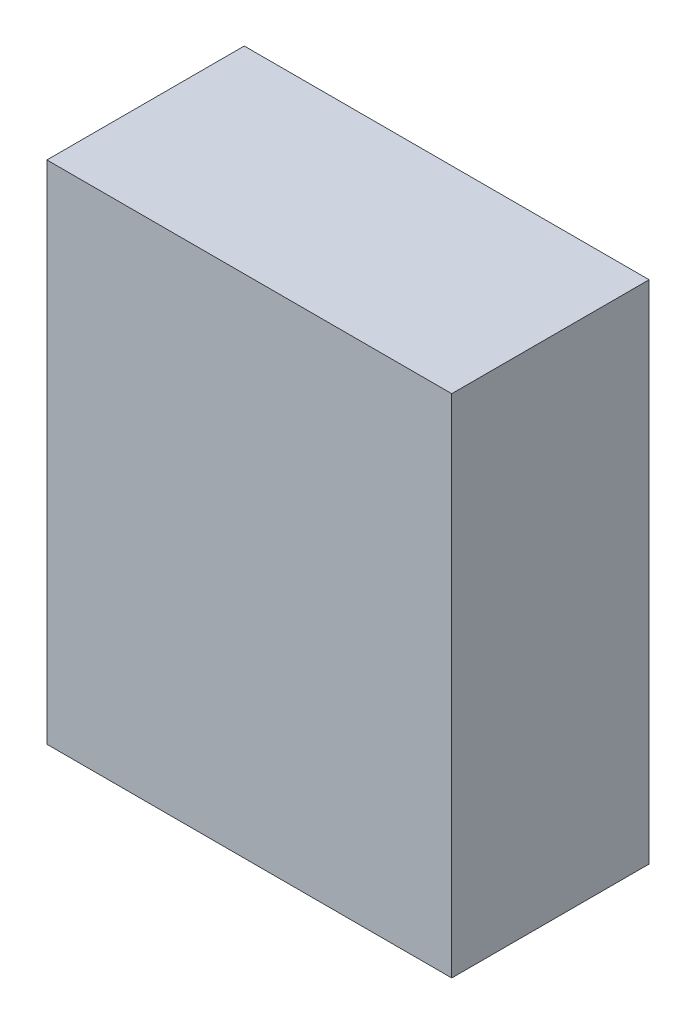
ISO-10303-21;
HEADER;
FILE_DESCRIPTION(('STEP AP214'),'2;1');
FILE_NAME('part.step','',(''),(''),'','','');
FILE_SCHEMA(('AUTOMOTIVE_DESIGN { 1 0 10303 214 1 1 1 1 }'));
ENDSEC;
DATA;
#1=APPLICATION_CONTEXT('core data for automotive mechanical design processes');
#2=APPLICATION_PROTOCOL_DEFINITION('international standard','automotive_design',2000,#1);
#3=PRODUCT_CONTEXT('',#1,'mechanical');
#4=PRODUCT('Part','Part','',(#3));
#5=PRODUCT_RELATED_PRODUCT_CATEGORY('part','',(#4));
#6=PRODUCT_DEFINITION_FORMATION('','',#4);
#7=PRODUCT_DEFINITION_CONTEXT('part definition',#1,'design');
#8=PRODUCT_DEFINITION('design','',#6,#7);
#9=PRODUCT_DEFINITION_SHAPE('','',#8);
#10=(LENGTH_UNIT() NAMED_UNIT(*) SI_UNIT(.MILLI.,.METRE.));
#11=(NAMED_UNIT(*) PLANE_ANGLE_UNIT() SI_UNIT($,.RADIAN.));
#12=(NAMED_UNIT(*) SI_UNIT($,.STERADIAN.) SOLID_ANGLE_UNIT());
#13=UNCERTAINTY_MEASURE_WITH_UNIT(LENGTH_MEASURE(1.E-05),#10,'distance_accuracy_value','');
#14=(GEOMETRIC_REPRESENTATION_CONTEXT(3) GLOBAL_UNCERTAINTY_ASSIGNED_CONTEXT((#13)) GLOBAL_UNIT_ASSIGNED_CONTEXT((#10,
#11,#12)) REPRESENTATION_CONTEXT('',''));
#15=CARTESIAN_POINT('',(0.,0.,0.));
#16=DIRECTION('',(0.,0.,1.));
#17=DIRECTION('',(1.,0.,0.));
#18=AXIS2_PLACEMENT_3D('',#15,#16,#17);
#19=CARTESIAN_POINT('',(-38.4444444444445,23.,19.5));
#20=DIRECTION('',(1.,0.,0.));
#21=DIRECTION('',(0.,0.,-1.));
#22=AXIS2_PLACEMENT_3D('',#19,#20,#21);
#23=PLANE('',#22);
#24=DIRECTION('',(0.,-1.,0.));
#25=VECTOR('',#24,1.);
#26=CARTESIAN_POINT('',(-38.4444444444445,23.,0.));
#27=LINE('',#26,#25);
#28=CARTESIAN_POINT('',(-38.4444444444445,23.,0.));
#29=VERTEX_POINT('',#28);
#30=CARTESIAN_POINT('',(-38.4444444444445,-27.,0.));
#31=VERTEX_POINT('',#30);
#32=EDGE_CURVE('E96',#29,#31,#27,.T.);
#33=ORIENTED_EDGE('',*,*,#32,.T.);
#34=DIRECTION('',(0.,0.,-1.));
#35=VECTOR('',#34,1.);
#36=CARTESIAN_POINT('',(-38.4444444444445,-27.,19.5));
#37=LINE('',#36,#35);
#38=CARTESIAN_POINT('',(-38.4444444444445,-27.,19.5));
#39=VERTEX_POINT('',#38);
#40=EDGE_CURVE('E11',#39,#31,#37,.T.);
#41=ORIENTED_EDGE('',*,*,#40,.F.);
#42=DIRECTION('',(0.,-1.,0.));
#43=VECTOR('',#42,1.);
#44=CARTESIAN_POINT('',(-38.4444444444445,23.,19.5));
#45=LINE('',#44,#43);
#46=CARTESIAN_POINT('',(-38.4444444444445,23.,19.5));
#47=VERTEX_POINT('',#46);
#48=EDGE_CURVE('E84',#47,#39,#45,.T.);
#49=ORIENTED_EDGE('',*,*,#48,.F.);
#50=DIRECTION('',(0.,0.,-1.));
#51=VECTOR('',#50,1.);
#52=CARTESIAN_POINT('',(-38.4444444444445,23.,19.5));
#53=LINE('',#52,#51);
#54=EDGE_CURVE('E92',#47,#29,#53,.T.);
#55=ORIENTED_EDGE('',*,*,#54,.T.);
#56=EDGE_LOOP('',(#33,#41,#49,#55));
#57=FACE_BOUND('',#56,.T.);
#58=ADVANCED_FACE('F33',(#57),#23,.F.);
#59=CARTESIAN_POINT('',(-38.4444444444445,-27.,19.5));
#60=DIRECTION('',(0.,1.,0.));
#61=DIRECTION('',(-1.,0.,0.));
#62=AXIS2_PLACEMENT_3D('',#59,#60,#61);
#63=PLANE('',#62);
#64=DIRECTION('',(1.,0.,0.));
#65=VECTOR('',#64,1.);
#66=CARTESIAN_POINT('',(-38.4444444444445,-27.,0.));
#67=LINE('',#66,#65);
#68=CARTESIAN_POINT('',(1.55555555555554,-27.,0.));
#69=VERTEX_POINT('',#68);
#70=EDGE_CURVE('E88',#31,#69,#67,.T.);
#71=ORIENTED_EDGE('',*,*,#70,.T.);
#72=DIRECTION('',(0.,0.,-1.));
#73=VECTOR('',#72,1.);
#74=CARTESIAN_POINT('',(1.55555555555554,-27.,19.5));
#75=LINE('',#74,#73);
#76=CARTESIAN_POINT('',(1.55555555555554,-27.,19.5));
#77=VERTEX_POINT('',#76);
#78=EDGE_CURVE('E41',#77,#69,#75,.T.);
#79=ORIENTED_EDGE('',*,*,#78,.F.);
#80=DIRECTION('',(1.,0.,0.));
#81=VECTOR('',#80,1.);
#82=CARTESIAN_POINT('',(-38.4444444444445,-27.,19.5));
#83=LINE('',#82,#81);
#84=EDGE_CURVE('E79',#39,#77,#83,.T.);
#85=ORIENTED_EDGE('',*,*,#84,.F.);
#86=ORIENTED_EDGE('',*,*,#40,.T.);
#87=EDGE_LOOP('',(#71,#79,#85,#86));
#88=FACE_BOUND('',#87,.T.);
#89=ADVANCED_FACE('F87',(#88),#63,.F.);
#90=CARTESIAN_POINT('',(1.55555555555553,23.,19.5));
#91=DIRECTION('',(-1.,0.,0.));
#92=DIRECTION('',(0.,-1.,0.));
#93=AXIS2_PLACEMENT_3D('',#90,#91,#92);
#94=PLANE('',#93);
#95=DIRECTION('',(0.,1.,0.));
#96=VECTOR('',#95,1.);
#97=CARTESIAN_POINT('',(1.55555555555553,23.,0.));
#98=LINE('',#97,#96);
#99=CARTESIAN_POINT('',(1.55555555555553,23.,0.));
#100=VERTEX_POINT('',#99);
#101=EDGE_CURVE('E66',#69,#100,#98,.T.);
#102=ORIENTED_EDGE('',*,*,#101,.T.);
#103=DIRECTION('',(0.,0.,-1.));
#104=VECTOR('',#103,1.);
#105=CARTESIAN_POINT('',(1.55555555555553,23.,19.5));
#106=LINE('',#105,#104);
#107=CARTESIAN_POINT('',(1.55555555555553,23.,19.5));
#108=VERTEX_POINT('',#107);
#109=EDGE_CURVE('E89',#108,#100,#106,.T.);
#110=ORIENTED_EDGE('',*,*,#109,.F.);
#111=DIRECTION('',(0.,1.,0.));
#112=VECTOR('',#111,1.);
#113=CARTESIAN_POINT('',(1.55555555555553,23.,19.5));
#114=LINE('',#113,#112);
#115=EDGE_CURVE('E82',#77,#108,#114,.T.);
#116=ORIENTED_EDGE('',*,*,#115,.F.);
#117=ORIENTED_EDGE('',*,*,#78,.T.);
#118=EDGE_LOOP('',(#102,#110,#116,#117));
#119=FACE_BOUND('',#118,.T.);
#120=ADVANCED_FACE('F90',(#119),#94,.F.);
#121=CARTESIAN_POINT('',(-38.4444444444445,23.,19.5));
#122=DIRECTION('',(0.,-1.,0.));
#123=DIRECTION('',(0.,0.,-1.));
#124=AXIS2_PLACEMENT_3D('',#121,#122,#123);
#125=PLANE('',#124);
#126=DIRECTION('',(-1.,0.,0.));
#127=VECTOR('',#126,1.);
#128=CARTESIAN_POINT('',(-38.4444444444445,23.,0.));
#129=LINE('',#128,#127);
#130=EDGE_CURVE('E72',#100,#29,#129,.T.);
#131=ORIENTED_EDGE('',*,*,#130,.T.);
#132=ORIENTED_EDGE('',*,*,#54,.F.);
#133=DIRECTION('',(-1.,0.,0.));
#134=VECTOR('',#133,1.);
#135=CARTESIAN_POINT('',(-38.4444444444445,23.,19.5));
#136=LINE('',#135,#134);
#137=EDGE_CURVE('E49',#108,#47,#136,.T.);
#138=ORIENTED_EDGE('',*,*,#137,.F.);
#139=ORIENTED_EDGE('',*,*,#109,.T.);
#140=EDGE_LOOP('',(#131,#132,#138,#139));
#141=FACE_BOUND('',#140,.T.);
#142=ADVANCED_FACE('F103',(#141),#125,.F.);
#143=CARTESIAN_POINT('',(0.,0.,19.5));
#144=DIRECTION('',(0.,0.,1.));
#145=DIRECTION('',(1.,0.,0.));
#146=AXIS2_PLACEMENT_3D('',#143,#144,#145);
#147=PLANE('',#146);
#148=ORIENTED_EDGE('',*,*,#48,.T.);
#149=ORIENTED_EDGE('',*,*,#84,.T.);
#150=ORIENTED_EDGE('',*,*,#115,.T.);
#151=ORIENTED_EDGE('',*,*,#137,.T.);
#152=EDGE_LOOP('',(#148,#149,#150,#151));
#153=FACE_BOUND('',#152,.T.);
#154=ADVANCED_FACE('F80',(#153),#147,.T.);
#155=CARTESIAN_POINT('',(0.,0.,0.));
#156=DIRECTION('',(0.,0.,1.));
#157=DIRECTION('',(1.,0.,0.));
#158=AXIS2_PLACEMENT_3D('',#155,#156,#157);
#159=PLANE('',#158);
#160=ORIENTED_EDGE('',*,*,#32,.F.);
#161=ORIENTED_EDGE('',*,*,#130,.F.);
#162=ORIENTED_EDGE('',*,*,#101,.F.);
#163=ORIENTED_EDGE('',*,*,#70,.F.);
#164=EDGE_LOOP('',(#160,#161,#162,#163));
#165=FACE_BOUND('',#164,.T.);
#166=ADVANCED_FACE('F106',(#165),#159,.F.);
#167=CLOSED_SHELL('',(#58,#89,#120,#142,#154,#166));
#168=MANIFOLD_SOLID_BREP('B2',#167);
#169=ADVANCED_BREP_SHAPE_REPRESENTATION('',(#18,#168),#14);
#170=SHAPE_DEFINITION_REPRESENTATION(#9,#169);
ENDSEC;
END-ISO-10303-21;
